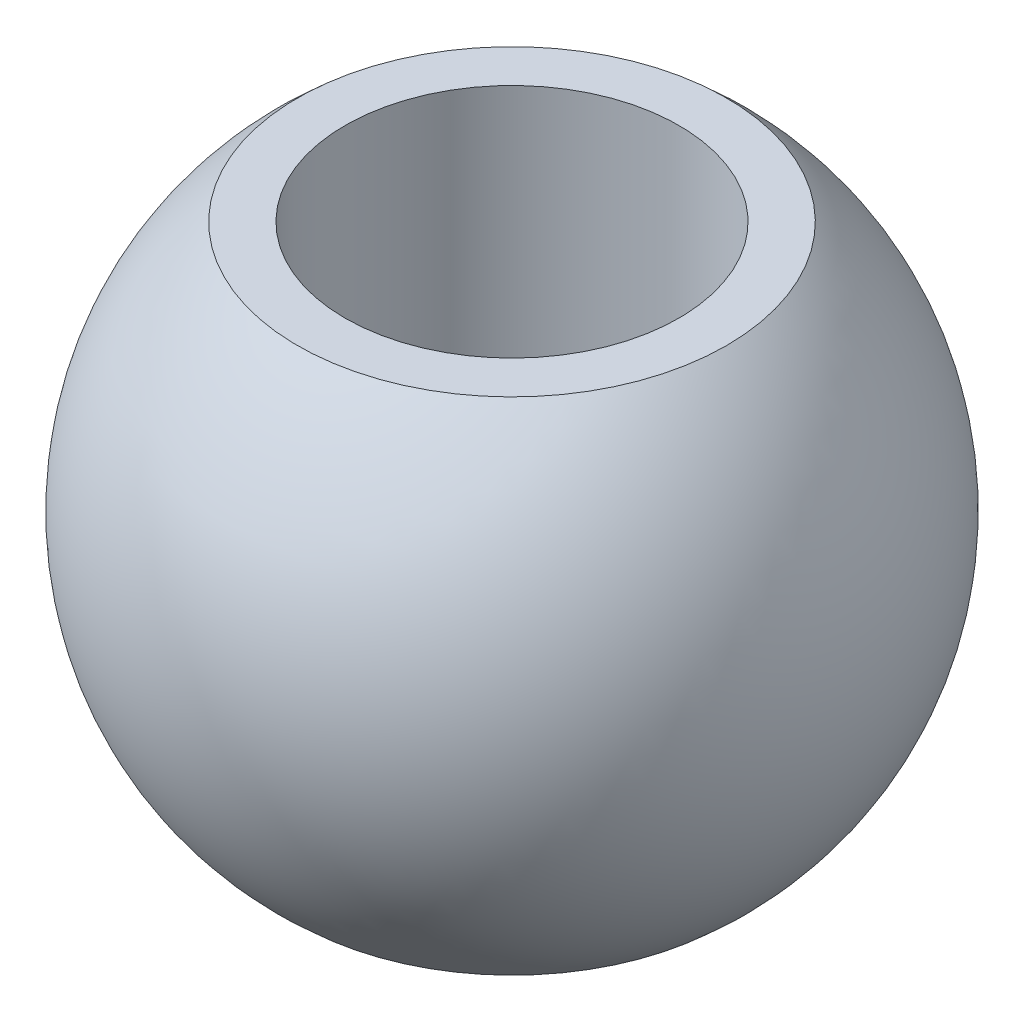
ISO-10303-21;
HEADER;
FILE_DESCRIPTION(('STEP AP214'),'2;1');
FILE_NAME('part.step','',(''),(''),'','','');
FILE_SCHEMA(('AUTOMOTIVE_DESIGN { 1 0 10303 214 1 1 1 1 }'));
ENDSEC;
DATA;
#1=APPLICATION_CONTEXT('core data for automotive mechanical design processes');
#2=APPLICATION_PROTOCOL_DEFINITION('international standard','automotive_design',2000,#1);
#3=PRODUCT_CONTEXT('',#1,'mechanical');
#4=PRODUCT('Part','Part','',(#3));
#5=PRODUCT_RELATED_PRODUCT_CATEGORY('part','',(#4));
#6=PRODUCT_DEFINITION_FORMATION('','',#4);
#7=PRODUCT_DEFINITION_CONTEXT('part definition',#1,'design');
#8=PRODUCT_DEFINITION('design','',#6,#7);
#9=PRODUCT_DEFINITION_SHAPE('','',#8);
#10=(LENGTH_UNIT() NAMED_UNIT(*) SI_UNIT(.MILLI.,.METRE.));
#11=(NAMED_UNIT(*) PLANE_ANGLE_UNIT() SI_UNIT($,.RADIAN.));
#12=(NAMED_UNIT(*) SI_UNIT($,.STERADIAN.) SOLID_ANGLE_UNIT());
#13=UNCERTAINTY_MEASURE_WITH_UNIT(LENGTH_MEASURE(1.E-05),#10,'distance_accuracy_value','');
#14=(GEOMETRIC_REPRESENTATION_CONTEXT(3) GLOBAL_UNCERTAINTY_ASSIGNED_CONTEXT((#13)) GLOBAL_UNIT_ASSIGNED_CONTEXT((#10,
#11,#12)) REPRESENTATION_CONTEXT('',''));
#15=CARTESIAN_POINT('',(0.,0.,0.));
#16=DIRECTION('',(0.,0.,1.));
#17=DIRECTION('',(1.,0.,0.));
#18=AXIS2_PLACEMENT_3D('',#15,#16,#17);
#19=CARTESIAN_POINT('',(0.,0.,0.));
#20=DIRECTION('',(0.,1.,0.));
#21=DIRECTION('',(1.,0.,0.));
#22=AXIS2_PLACEMENT_3D('',#19,#20,#21);
#23=SPHERICAL_SURFACE('',#22,7.9);
#24=CARTESIAN_POINT('',(0.,-6.,0.));
#25=DIRECTION('',(0.,1.,0.));
#26=DIRECTION('',(0.,0.,1.));
#27=AXIS2_PLACEMENT_3D('',#24,#25,#26);
#28=CIRCLE('',#27,5.13906606301184);
#29=CARTESIAN_POINT('',(5.13906606301184,-6.,0.));
#30=VERTEX_POINT('',#29);
#31=EDGE_CURVE('E10',#30,#30,#28,.T.);
#32=CARTESIAN_POINT('',(0.,6.,0.));
#33=DIRECTION('',(0.,1.,0.));
#34=DIRECTION('',(0.,0.,1.));
#35=AXIS2_PLACEMENT_3D('',#32,#33,#34);
#36=CIRCLE('',#35,5.13906606301184);
#37=CARTESIAN_POINT('',(5.13906606301184,6.,0.));
#38=VERTEX_POINT('',#37);
#39=EDGE_CURVE('E48',#38,#38,#36,.T.);
#40=CARTESIAN_POINT('',(5.13906606301184,-6.,0.));
#41=CARTESIAN_POINT('',(5.24688561650708,-5.90765661555555,0.));
#42=CARTESIAN_POINT('',(5.35221067116129,-5.81240140848863,0.));
#43=CARTESIAN_POINT('',(5.55757787550385,-5.61635678595464,0.));
#44=CARTESIAN_POINT('',(5.65762002519222,-5.51556737048758,0.));
#45=CARTESIAN_POINT('',(5.85212751231939,-5.30874376799812,0.));
#46=CARTESIAN_POINT('',(5.94659284975818,-5.20270958097572,0.));
#47=CARTESIAN_POINT('',(6.12967312079551,-4.98570541883886,0.));
#48=CARTESIAN_POINT('',(6.21828805439404,-4.87473544372441,0.));
#49=CARTESIAN_POINT('',(6.38940982198355,-4.64818187493293,0.));
#50=CARTESIAN_POINT('',(6.47191665597453,-4.5325982812559,0.));
#51=CARTESIAN_POINT('',(6.63058257040972,-4.29715335866014,0.));
#52=CARTESIAN_POINT('',(6.70674165085394,-4.1772920297414,0.));
#53=CARTESIAN_POINT('',(6.85249076797454,-3.93363986568163,0.));
#54=CARTESIAN_POINT('',(6.92208080465094,-3.8098490305406,0.));
#55=CARTESIAN_POINT('',(7.05448965099329,-3.55869752209873,0.));
#56=CARTESIAN_POINT('',(7.11730846065926,-3.4313368487979,0.));
#57=CARTESIAN_POINT('',(7.2359923372613,-3.17341569799846,0.));
#58=CARTESIAN_POINT('',(7.29185740419737,-3.04285522049986,0.));
#59=CARTESIAN_POINT('',(7.39647148462935,-2.77891379361074,0.));
#60=CARTESIAN_POINT('',(7.44522049812525,-2.64553284422022,0.));
#61=CARTESIAN_POINT('',(7.53546083562533,-2.37633800005853,0.));
#62=CARTESIAN_POINT('',(7.57695215962949,-2.24052410528737,0.));
#63=CARTESIAN_POINT('',(7.65255656878145,-1.96685796569869,0.));
#64=CARTESIAN_POINT('',(7.68666965392923,-1.82900572088118,0.));
#65=CARTESIAN_POINT('',(7.74741847279768,-1.55166339874996,0.));
#66=CARTESIAN_POINT('',(7.77405420651834,-1.41217332143625,0.));
#67=CARTESIAN_POINT('',(7.81977093475568,-1.1319606104491,0.));
#68=CARTESIAN_POINT('',(7.83885192927236,-0.991237976775657,0.));
#69=CARTESIAN_POINT('',(7.86940374095221,-0.708969010287228,0.));
#70=CARTESIAN_POINT('',(7.88087455811537,-0.567422677472244,0.));
#71=CARTESIAN_POINT('',(7.89617268763927,-0.283917563104841,0.));
#72=CARTESIAN_POINT('',(7.9,-0.141958781552421,0.));
#73=CARTESIAN_POINT('',(7.9,0.141958781552419,0.));
#74=CARTESIAN_POINT('',(7.89617268763927,0.283917563104839,0.));
#75=CARTESIAN_POINT('',(7.88087455811537,0.567422677472243,0.));
#76=CARTESIAN_POINT('',(7.86940374095221,0.708969010287226,0.));
#77=CARTESIAN_POINT('',(7.83885192927236,0.991237976775655,0.));
#78=CARTESIAN_POINT('',(7.81977093475568,1.1319606104491,0.));
#79=CARTESIAN_POINT('',(7.77405420651834,1.41217332143625,0.));
#80=CARTESIAN_POINT('',(7.74741847279768,1.55166339874996,0.));
#81=CARTESIAN_POINT('',(7.68666965392923,1.82900572088118,0.));
#82=CARTESIAN_POINT('',(7.65255656878145,1.96685796569869,0.));
#83=CARTESIAN_POINT('',(7.5769521596295,2.24052410528737,0.));
#84=CARTESIAN_POINT('',(7.53546083562533,2.37633800005853,0.));
#85=CARTESIAN_POINT('',(7.44522049812525,2.64553284422022,0.));
#86=CARTESIAN_POINT('',(7.39647148462935,2.77891379361074,0.));
#87=CARTESIAN_POINT('',(7.29185740419738,3.04285522049986,0.));
#88=CARTESIAN_POINT('',(7.2359923372613,3.17341569799846,0.));
#89=CARTESIAN_POINT('',(7.11730846065926,3.43133684879789,0.));
#90=CARTESIAN_POINT('',(7.05448965099329,3.55869752209873,0.));
#91=CARTESIAN_POINT('',(6.92208080465094,3.8098490305406,0.));
#92=CARTESIAN_POINT('',(6.85249076797455,3.93363986568163,0.));
#93=CARTESIAN_POINT('',(6.70674165085394,4.1772920297414,0.));
#94=CARTESIAN_POINT('',(6.63058257040973,4.29715335866014,0.));
#95=CARTESIAN_POINT('',(6.47191665597453,4.5325982812559,0.));
#96=CARTESIAN_POINT('',(6.38940982198355,4.64818187493293,0.));
#97=CARTESIAN_POINT('',(6.21828805439405,4.87473544372441,0.));
#98=CARTESIAN_POINT('',(6.12967312079551,4.98570541883886,0.));
#99=CARTESIAN_POINT('',(5.94659284975819,5.20270958097572,0.));
#100=CARTESIAN_POINT('',(5.85212751231939,5.30874376799812,0.));
#101=CARTESIAN_POINT('',(5.65762002519222,5.51556737048758,0.));
#102=CARTESIAN_POINT('',(5.55757787550385,5.61635678595464,0.));
#103=CARTESIAN_POINT('',(5.35221067116129,5.81240140848863,0.));
#104=CARTESIAN_POINT('',(5.24688561650709,5.90765661555555,0.));
#105=CARTESIAN_POINT('',(5.13906606301184,6.,0.));
#106=B_SPLINE_CURVE_WITH_KNOTS('',3,(#40,#41,#42,#43,#44,#45,#46,#47,#48,#49,#50,#51,#52,#53,
#54,#55,#56,#57,#58,#59,#60,#61,#62,#63,#64,#65,#66,#67,#68,#69,#70,#71,#72,#73,#74,#75,#76,#77,
#78,#79,#80,#81,#82,#83,#84,#85,#86,#87,#88,#89,#90,#91,#92,#93,#94,#95,#96,#97,#98,#99,#100,
#101,#102,#103,#104,#105),.UNSPECIFIED.,.F.,.F.,(4,2,2,2,2,2,2,2,2,2,2,2,2,2,2,2,2,2,2,2,2,2,2,
2,2,2,2,2,2,2,2,2,4),(0.,0.425824797937278,0.851649595874556,1.27747439381183,1.70329919174911,
2.12912398968639,2.55494878762367,2.98077358556095,3.40659838349822,3.8324231814355,
4.25824797937278,4.68407277731006,5.10989757524734,5.53572237318462,5.96154717112189,
6.38737196905917,6.81319676699645,7.23902156493373,7.66484636287101,8.09067116080828,
8.51649595874556,8.94232075668284,9.36814555462012,9.7939703525574,10.2197951504947,
10.645619948432,11.0714447463692,11.4972695443065,11.9230943422438,12.3489191401811,
12.7747439381183,13.2005687360556,13.6263935339929),.UNSPECIFIED.);
#107=EDGE_CURVE('BSEAM34',#30,#38,#106,.T.);
#108=ORIENTED_EDGE('',*,*,#31,.T.);
#109=ORIENTED_EDGE('',*,*,#39,.F.);
#110=ORIENTED_EDGE('',*,*,#107,.T.);
#111=ORIENTED_EDGE('',*,*,#107,.F.);
#112=EDGE_LOOP('',(#108,#110,#109,#111));
#113=FACE_BOUND('',#112,.T.);
#114=ADVANCED_FACE('F34',(#113),#23,.T.);
#115=CARTESIAN_POINT('',(5.13906606301184,-6.,0.));
#116=DIRECTION('',(0.,-1.,0.));
#117=DIRECTION('',(0.,0.,-1.));
#118=AXIS2_PLACEMENT_3D('',#115,#116,#117);
#119=PLANE('',#118);
#120=CARTESIAN_POINT('',(0.,-6.,0.));
#121=DIRECTION('',(0.,1.,0.));
#122=DIRECTION('',(0.,0.,1.));
#123=AXIS2_PLACEMENT_3D('',#120,#121,#122);
#124=CIRCLE('',#123,4.);
#125=CARTESIAN_POINT('',(0.,-6.,4.));
#126=VERTEX_POINT('',#125);
#127=EDGE_CURVE('E40',#126,#126,#124,.T.);
#128=ORIENTED_EDGE('',*,*,#127,.T.);
#129=EDGE_LOOP('',(#128));
#130=FACE_BOUND('',#129,.T.);
#131=ORIENTED_EDGE('',*,*,#31,.F.);
#132=EDGE_LOOP('',(#131));
#133=FACE_BOUND('',#132,.T.);
#134=ADVANCED_FACE('F58',(#130,#133),#119,.T.);
#135=CARTESIAN_POINT('',(0.,-6.,0.));
#136=DIRECTION('',(0.,1.,0.));
#137=DIRECTION('',(0.,0.,1.));
#138=AXIS2_PLACEMENT_3D('',#135,#136,#137);
#139=CYLINDRICAL_SURFACE('',#138,4.);
#140=CARTESIAN_POINT('',(0.,6.,0.));
#141=DIRECTION('',(0.,1.,0.));
#142=DIRECTION('',(0.,0.,1.));
#143=AXIS2_PLACEMENT_3D('',#140,#141,#142);
#144=CIRCLE('',#143,4.);
#145=CARTESIAN_POINT('',(0.,6.,4.));
#146=VERTEX_POINT('',#145);
#147=EDGE_CURVE('E44',#146,#146,#144,.T.);
#148=ORIENTED_EDGE('',*,*,#147,.T.);
#149=EDGE_LOOP('',(#148));
#150=FACE_BOUND('',#149,.T.);
#151=ORIENTED_EDGE('',*,*,#127,.F.);
#152=EDGE_LOOP('',(#151));
#153=FACE_BOUND('',#152,.T.);
#154=ADVANCED_FACE('F62',(#150,#153),#139,.F.);
#155=CARTESIAN_POINT('',(4.,6.,0.));
#156=DIRECTION('',(0.,1.,0.));
#157=DIRECTION('',(0.,0.,1.));
#158=AXIS2_PLACEMENT_3D('',#155,#156,#157);
#159=PLANE('',#158);
#160=ORIENTED_EDGE('',*,*,#39,.T.);
#161=EDGE_LOOP('',(#160));
#162=FACE_BOUND('',#161,.T.);
#163=ORIENTED_EDGE('',*,*,#147,.F.);
#164=EDGE_LOOP('',(#163));
#165=FACE_BOUND('',#164,.T.);
#166=ADVANCED_FACE('F54',(#162,#165),#159,.T.);
#167=CLOSED_SHELL('',(#114,#134,#154,#166));
#168=MANIFOLD_SOLID_BREP('B2',#167);
#169=ADVANCED_BREP_SHAPE_REPRESENTATION('',(#18,#168),#14);
#170=SHAPE_DEFINITION_REPRESENTATION(#9,#169);
ENDSEC;
END-ISO-10303-21;
